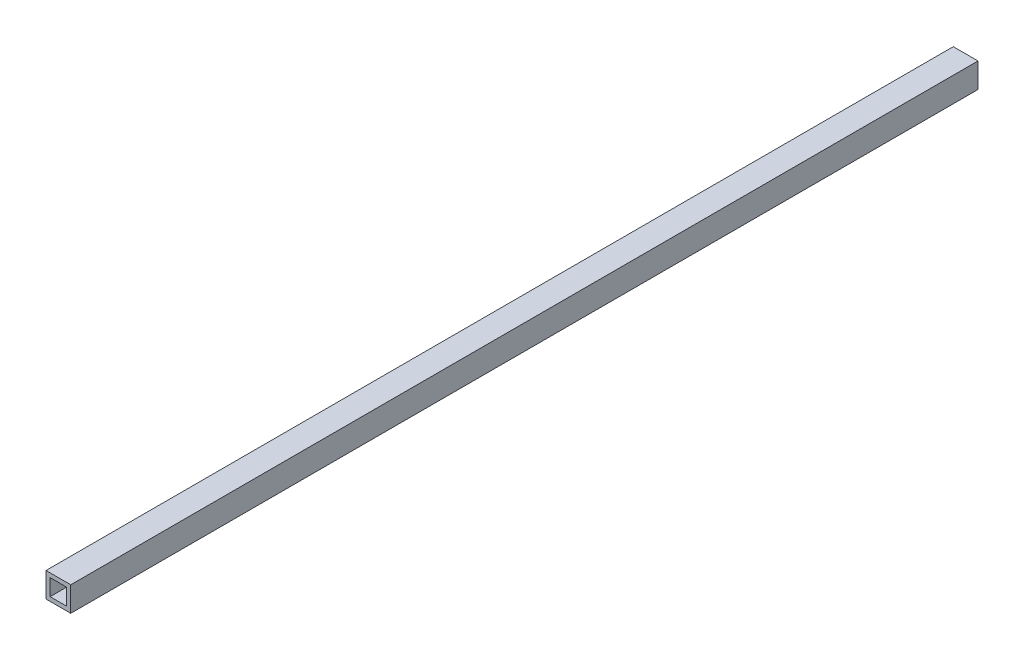
ISO-10303-21;
HEADER;
FILE_DESCRIPTION(('STEP AP214'),'2;1');
FILE_NAME('part.step','',(''),(''),'','','');
FILE_SCHEMA(('AUTOMOTIVE_DESIGN { 1 0 10303 214 1 1 1 1 }'));
ENDSEC;
DATA;
#1=APPLICATION_CONTEXT('core data for automotive mechanical design processes');
#2=APPLICATION_PROTOCOL_DEFINITION('international standard','automotive_design',2000,#1);
#3=PRODUCT_CONTEXT('',#1,'mechanical');
#4=PRODUCT('Part','Part','',(#3));
#5=PRODUCT_RELATED_PRODUCT_CATEGORY('part','',(#4));
#6=PRODUCT_DEFINITION_FORMATION('','',#4);
#7=PRODUCT_DEFINITION_CONTEXT('part definition',#1,'design');
#8=PRODUCT_DEFINITION('design','',#6,#7);
#9=PRODUCT_DEFINITION_SHAPE('','',#8);
#10=(LENGTH_UNIT() NAMED_UNIT(*) SI_UNIT(.MILLI.,.METRE.));
#11=(NAMED_UNIT(*) PLANE_ANGLE_UNIT() SI_UNIT($,.RADIAN.));
#12=(NAMED_UNIT(*) SI_UNIT($,.STERADIAN.) SOLID_ANGLE_UNIT());
#13=UNCERTAINTY_MEASURE_WITH_UNIT(LENGTH_MEASURE(1.E-05),#10,'distance_accuracy_value','');
#14=(GEOMETRIC_REPRESENTATION_CONTEXT(3) GLOBAL_UNCERTAINTY_ASSIGNED_CONTEXT((#13)) GLOBAL_UNIT_ASSIGNED_CONTEXT((#10,
#11,#12)) REPRESENTATION_CONTEXT('',''));
#15=CARTESIAN_POINT('',(0.,0.,0.));
#16=DIRECTION('',(0.,0.,1.));
#17=DIRECTION('',(1.,0.,0.));
#18=AXIS2_PLACEMENT_3D('',#15,#16,#17);
#19=CARTESIAN_POINT('',(0.,0.,698.5));
#20=DIRECTION('',(0.,0.,1.));
#21=DIRECTION('',(1.,0.,0.));
#22=AXIS2_PLACEMENT_3D('',#19,#20,#21);
#23=PLANE('',#22);
#24=DIRECTION('',(0.,-1.,0.));
#25=VECTOR('',#24,1.);
#26=CARTESIAN_POINT('',(-9.52500000000001,-9.525,698.5));
#27=LINE('',#26,#25);
#28=CARTESIAN_POINT('',(-9.52500000000001,9.525,698.5));
#29=VERTEX_POINT('',#28);
#30=CARTESIAN_POINT('',(-9.52500000000001,-9.525,698.5));
#31=VERTEX_POINT('',#30);
#32=EDGE_CURVE('E133',#29,#31,#27,.T.);
#33=ORIENTED_EDGE('',*,*,#32,.T.);
#34=DIRECTION('',(1.,0.,0.));
#35=VECTOR('',#34,1.);
#36=CARTESIAN_POINT('',(9.525,-9.525,698.5));
#37=LINE('',#36,#35);
#38=CARTESIAN_POINT('',(9.525,-9.525,698.5));
#39=VERTEX_POINT('',#38);
#40=EDGE_CURVE('E136',#31,#39,#37,.T.);
#41=ORIENTED_EDGE('',*,*,#40,.T.);
#42=DIRECTION('',(0.,1.,0.));
#43=VECTOR('',#42,1.);
#44=CARTESIAN_POINT('',(9.525,-9.525,698.5));
#45=LINE('',#44,#43);
#46=CARTESIAN_POINT('',(9.525,9.525,698.5));
#47=VERTEX_POINT('',#46);
#48=EDGE_CURVE('E139',#39,#47,#45,.T.);
#49=ORIENTED_EDGE('',*,*,#48,.T.);
#50=DIRECTION('',(-1.,0.,0.));
#51=VECTOR('',#50,1.);
#52=CARTESIAN_POINT('',(9.525,9.525,698.5));
#53=LINE('',#52,#51);
#54=EDGE_CURVE('E141',#47,#29,#53,.T.);
#55=ORIENTED_EDGE('',*,*,#54,.T.);
#56=EDGE_LOOP('',(#33,#41,#49,#55));
#57=FACE_BOUND('',#56,.T.);
#58=DIRECTION('',(1.,0.,0.));
#59=VECTOR('',#58,1.);
#60=CARTESIAN_POINT('',(6.35,-6.35,698.5));
#61=LINE('',#60,#59);
#62=CARTESIAN_POINT('',(-6.35,-6.35,698.5));
#63=VERTEX_POINT('',#62);
#64=CARTESIAN_POINT('',(6.35,-6.35,698.5));
#65=VERTEX_POINT('',#64);
#66=EDGE_CURVE('E105',#63,#65,#61,.T.);
#67=ORIENTED_EDGE('',*,*,#66,.F.);
#68=DIRECTION('',(0.,-1.,0.));
#69=VECTOR('',#68,1.);
#70=CARTESIAN_POINT('',(-6.35,-6.35,698.5));
#71=LINE('',#70,#69);
#72=CARTESIAN_POINT('',(-6.35,6.35,698.5));
#73=VERTEX_POINT('',#72);
#74=EDGE_CURVE('E97',#73,#63,#71,.T.);
#75=ORIENTED_EDGE('',*,*,#74,.F.);
#76=DIRECTION('',(-1.,0.,0.));
#77=VECTOR('',#76,1.);
#78=CARTESIAN_POINT('',(6.35,6.35,698.5));
#79=LINE('',#78,#77);
#80=CARTESIAN_POINT('',(6.35,6.35,698.5));
#81=VERTEX_POINT('',#80);
#82=EDGE_CURVE('E119',#81,#73,#79,.T.);
#83=ORIENTED_EDGE('',*,*,#82,.F.);
#84=DIRECTION('',(0.,1.,0.));
#85=VECTOR('',#84,1.);
#86=CARTESIAN_POINT('',(6.35,-6.35,698.5));
#87=LINE('',#86,#85);
#88=EDGE_CURVE('E117',#65,#81,#87,.T.);
#89=ORIENTED_EDGE('',*,*,#88,.F.);
#90=EDGE_LOOP('',(#67,#75,#83,#89));
#91=FACE_BOUND('',#90,.T.);
#92=ADVANCED_FACE('F32',(#57,#91),#23,.T.);
#93=CARTESIAN_POINT('',(0.,0.,0.));
#94=DIRECTION('',(0.,0.,1.));
#95=DIRECTION('',(1.,0.,0.));
#96=AXIS2_PLACEMENT_3D('',#93,#94,#95);
#97=PLANE('',#96);
#98=DIRECTION('',(0.,-1.,0.));
#99=VECTOR('',#98,1.);
#100=CARTESIAN_POINT('',(-9.52500000000001,-9.525,0.));
#101=LINE('',#100,#99);
#102=CARTESIAN_POINT('',(-9.52500000000001,9.525,0.));
#103=VERTEX_POINT('',#102);
#104=CARTESIAN_POINT('',(-9.52500000000001,-9.525,0.));
#105=VERTEX_POINT('',#104);
#106=EDGE_CURVE('E113',#103,#105,#101,.T.);
#107=ORIENTED_EDGE('',*,*,#106,.F.);
#108=DIRECTION('',(-1.,0.,0.));
#109=VECTOR('',#108,1.);
#110=CARTESIAN_POINT('',(9.525,9.525,0.));
#111=LINE('',#110,#109);
#112=CARTESIAN_POINT('',(9.525,9.525,0.));
#113=VERTEX_POINT('',#112);
#114=EDGE_CURVE('E137',#113,#103,#111,.T.);
#115=ORIENTED_EDGE('',*,*,#114,.F.);
#116=DIRECTION('',(0.,1.,0.));
#117=VECTOR('',#116,1.);
#118=CARTESIAN_POINT('',(9.525,-9.525,0.));
#119=LINE('',#118,#117);
#120=CARTESIAN_POINT('',(9.525,-9.525,0.));
#121=VERTEX_POINT('',#120);
#122=EDGE_CURVE('E148',#121,#113,#119,.T.);
#123=ORIENTED_EDGE('',*,*,#122,.F.);
#124=DIRECTION('',(1.,0.,0.));
#125=VECTOR('',#124,1.);
#126=CARTESIAN_POINT('',(9.525,-9.525,0.));
#127=LINE('',#126,#125);
#128=EDGE_CURVE('E146',#105,#121,#127,.T.);
#129=ORIENTED_EDGE('',*,*,#128,.F.);
#130=EDGE_LOOP('',(#107,#115,#123,#129));
#131=FACE_BOUND('',#130,.T.);
#132=DIRECTION('',(0.,-1.,0.));
#133=VECTOR('',#132,1.);
#134=CARTESIAN_POINT('',(-6.35,-6.35,0.));
#135=LINE('',#134,#133);
#136=CARTESIAN_POINT('',(-6.35,6.35,0.));
#137=VERTEX_POINT('',#136);
#138=CARTESIAN_POINT('',(-6.35,-6.35,0.));
#139=VERTEX_POINT('',#138);
#140=EDGE_CURVE('E55',#137,#139,#135,.T.);
#141=ORIENTED_EDGE('',*,*,#140,.T.);
#142=DIRECTION('',(1.,0.,0.));
#143=VECTOR('',#142,1.);
#144=CARTESIAN_POINT('',(6.35,-6.35,0.));
#145=LINE('',#144,#143);
#146=CARTESIAN_POINT('',(6.35,-6.35,0.));
#147=VERTEX_POINT('',#146);
#148=EDGE_CURVE('E112',#139,#147,#145,.T.);
#149=ORIENTED_EDGE('',*,*,#148,.T.);
#150=DIRECTION('',(0.,1.,0.));
#151=VECTOR('',#150,1.);
#152=CARTESIAN_POINT('',(6.35,-6.35,0.));
#153=LINE('',#152,#151);
#154=CARTESIAN_POINT('',(6.35,6.35,0.));
#155=VERTEX_POINT('',#154);
#156=EDGE_CURVE('E125',#147,#155,#153,.T.);
#157=ORIENTED_EDGE('',*,*,#156,.T.);
#158=DIRECTION('',(-1.,0.,0.));
#159=VECTOR('',#158,1.);
#160=CARTESIAN_POINT('',(6.35,6.35,0.));
#161=LINE('',#160,#159);
#162=EDGE_CURVE('E106',#155,#137,#161,.T.);
#163=ORIENTED_EDGE('',*,*,#162,.T.);
#164=EDGE_LOOP('',(#141,#149,#157,#163));
#165=FACE_BOUND('',#164,.T.);
#166=ADVANCED_FACE('F166',(#131,#165),#97,.F.);
#167=CARTESIAN_POINT('',(-9.52500000000001,-9.525,698.5));
#168=DIRECTION('',(1.,0.,0.));
#169=DIRECTION('',(0.,0.,-1.));
#170=AXIS2_PLACEMENT_3D('',#167,#168,#169);
#171=PLANE('',#170);
#172=ORIENTED_EDGE('',*,*,#106,.T.);
#173=DIRECTION('',(0.,0.,-1.));
#174=VECTOR('',#173,1.);
#175=CARTESIAN_POINT('',(-9.52500000000001,-9.525,698.5));
#176=LINE('',#175,#174);
#177=EDGE_CURVE('E11',#31,#105,#176,.T.);
#178=ORIENTED_EDGE('',*,*,#177,.F.);
#179=ORIENTED_EDGE('',*,*,#32,.F.);
#180=DIRECTION('',(0.,0.,-1.));
#181=VECTOR('',#180,1.);
#182=CARTESIAN_POINT('',(-9.52500000000001,9.525,698.5));
#183=LINE('',#182,#181);
#184=EDGE_CURVE('E143',#29,#103,#183,.T.);
#185=ORIENTED_EDGE('',*,*,#184,.T.);
#186=EDGE_LOOP('',(#172,#178,#179,#185));
#187=FACE_BOUND('',#186,.T.);
#188=ADVANCED_FACE('F34',(#187),#171,.F.);
#189=CARTESIAN_POINT('',(9.525,-9.525,698.5));
#190=DIRECTION('',(0.,1.,0.));
#191=DIRECTION('',(0.,0.,1.));
#192=AXIS2_PLACEMENT_3D('',#189,#190,#191);
#193=PLANE('',#192);
#194=ORIENTED_EDGE('',*,*,#128,.T.);
#195=DIRECTION('',(0.,0.,-1.));
#196=VECTOR('',#195,1.);
#197=CARTESIAN_POINT('',(9.525,-9.525,698.5));
#198=LINE('',#197,#196);
#199=EDGE_CURVE('E40',#39,#121,#198,.T.);
#200=ORIENTED_EDGE('',*,*,#199,.F.);
#201=ORIENTED_EDGE('',*,*,#40,.F.);
#202=ORIENTED_EDGE('',*,*,#177,.T.);
#203=EDGE_LOOP('',(#194,#200,#201,#202));
#204=FACE_BOUND('',#203,.T.);
#205=ADVANCED_FACE('F176',(#204),#193,.F.);
#206=CARTESIAN_POINT('',(9.525,-9.525,698.5));
#207=DIRECTION('',(-1.,0.,0.));
#208=DIRECTION('',(0.,0.,1.));
#209=AXIS2_PLACEMENT_3D('',#206,#207,#208);
#210=PLANE('',#209);
#211=ORIENTED_EDGE('',*,*,#122,.T.);
#212=DIRECTION('',(0.,0.,-1.));
#213=VECTOR('',#212,1.);
#214=CARTESIAN_POINT('',(9.525,9.525,698.5));
#215=LINE('',#214,#213);
#216=EDGE_CURVE('E153',#47,#113,#215,.T.);
#217=ORIENTED_EDGE('',*,*,#216,.F.);
#218=ORIENTED_EDGE('',*,*,#48,.F.);
#219=ORIENTED_EDGE('',*,*,#199,.T.);
#220=EDGE_LOOP('',(#211,#217,#218,#219));
#221=FACE_BOUND('',#220,.T.);
#222=ADVANCED_FACE('F160',(#221),#210,.F.);
#223=CARTESIAN_POINT('',(9.525,9.525,698.5));
#224=DIRECTION('',(0.,-1.,0.));
#225=DIRECTION('',(0.,0.,-1.));
#226=AXIS2_PLACEMENT_3D('',#223,#224,#225);
#227=PLANE('',#226);
#228=ORIENTED_EDGE('',*,*,#114,.T.);
#229=ORIENTED_EDGE('',*,*,#184,.F.);
#230=ORIENTED_EDGE('',*,*,#54,.F.);
#231=ORIENTED_EDGE('',*,*,#216,.T.);
#232=EDGE_LOOP('',(#228,#229,#230,#231));
#233=FACE_BOUND('',#232,.T.);
#234=ADVANCED_FACE('F170',(#233),#227,.F.);
#235=CARTESIAN_POINT('',(-6.35,-6.35,698.5));
#236=DIRECTION('',(1.,0.,0.));
#237=DIRECTION('',(0.,0.,-1.));
#238=AXIS2_PLACEMENT_3D('',#235,#236,#237);
#239=PLANE('',#238);
#240=ORIENTED_EDGE('',*,*,#140,.F.);
#241=DIRECTION('',(0.,0.,-1.));
#242=VECTOR('',#241,1.);
#243=CARTESIAN_POINT('',(-6.35,6.35,698.5));
#244=LINE('',#243,#242);
#245=EDGE_CURVE('E101',#73,#137,#244,.T.);
#246=ORIENTED_EDGE('',*,*,#245,.F.);
#247=ORIENTED_EDGE('',*,*,#74,.T.);
#248=DIRECTION('',(0.,0.,-1.));
#249=VECTOR('',#248,1.);
#250=CARTESIAN_POINT('',(-6.35,-6.35,698.5));
#251=LINE('',#250,#249);
#252=EDGE_CURVE('E100',#63,#139,#251,.T.);
#253=ORIENTED_EDGE('',*,*,#252,.T.);
#254=EDGE_LOOP('',(#240,#246,#247,#253));
#255=FACE_BOUND('',#254,.T.);
#256=ADVANCED_FACE('F99',(#255),#239,.T.);
#257=CARTESIAN_POINT('',(6.35,-6.35,698.5));
#258=DIRECTION('',(0.,1.,0.));
#259=DIRECTION('',(0.,0.,1.));
#260=AXIS2_PLACEMENT_3D('',#257,#258,#259);
#261=PLANE('',#260);
#262=ORIENTED_EDGE('',*,*,#148,.F.);
#263=ORIENTED_EDGE('',*,*,#252,.F.);
#264=ORIENTED_EDGE('',*,*,#66,.T.);
#265=DIRECTION('',(0.,0.,-1.));
#266=VECTOR('',#265,1.);
#267=CARTESIAN_POINT('',(6.35,-6.35,698.5));
#268=LINE('',#267,#266);
#269=EDGE_CURVE('E114',#65,#147,#268,.T.);
#270=ORIENTED_EDGE('',*,*,#269,.T.);
#271=EDGE_LOOP('',(#262,#263,#264,#270));
#272=FACE_BOUND('',#271,.T.);
#273=ADVANCED_FACE('F109',(#272),#261,.T.);
#274=CARTESIAN_POINT('',(6.35,-6.35,698.5));
#275=DIRECTION('',(-1.,0.,0.));
#276=DIRECTION('',(0.,0.,1.));
#277=AXIS2_PLACEMENT_3D('',#274,#275,#276);
#278=PLANE('',#277);
#279=ORIENTED_EDGE('',*,*,#156,.F.);
#280=ORIENTED_EDGE('',*,*,#269,.F.);
#281=ORIENTED_EDGE('',*,*,#88,.T.);
#282=DIRECTION('',(0.,0.,-1.));
#283=VECTOR('',#282,1.);
#284=CARTESIAN_POINT('',(6.35,6.35,698.5));
#285=LINE('',#284,#283);
#286=EDGE_CURVE('E47',#81,#155,#285,.T.);
#287=ORIENTED_EDGE('',*,*,#286,.T.);
#288=EDGE_LOOP('',(#279,#280,#281,#287));
#289=FACE_BOUND('',#288,.T.);
#290=ADVANCED_FACE('F199',(#289),#278,.T.);
#291=CARTESIAN_POINT('',(6.35,6.35,698.5));
#292=DIRECTION('',(0.,-1.,0.));
#293=DIRECTION('',(0.,0.,-1.));
#294=AXIS2_PLACEMENT_3D('',#291,#292,#293);
#295=PLANE('',#294);
#296=ORIENTED_EDGE('',*,*,#162,.F.);
#297=ORIENTED_EDGE('',*,*,#286,.F.);
#298=ORIENTED_EDGE('',*,*,#82,.T.);
#299=ORIENTED_EDGE('',*,*,#245,.T.);
#300=EDGE_LOOP('',(#296,#297,#298,#299));
#301=FACE_BOUND('',#300,.T.);
#302=ADVANCED_FACE('F203',(#301),#295,.T.);
#303=CLOSED_SHELL('',(#92,#166,#188,#205,#222,#234,#256,#273,#290,#302));
#304=MANIFOLD_SOLID_BREP('B2',#303);
#305=ADVANCED_BREP_SHAPE_REPRESENTATION('',(#18,#304),#14);
#306=SHAPE_DEFINITION_REPRESENTATION(#9,#305);
ENDSEC;
END-ISO-10303-21;
